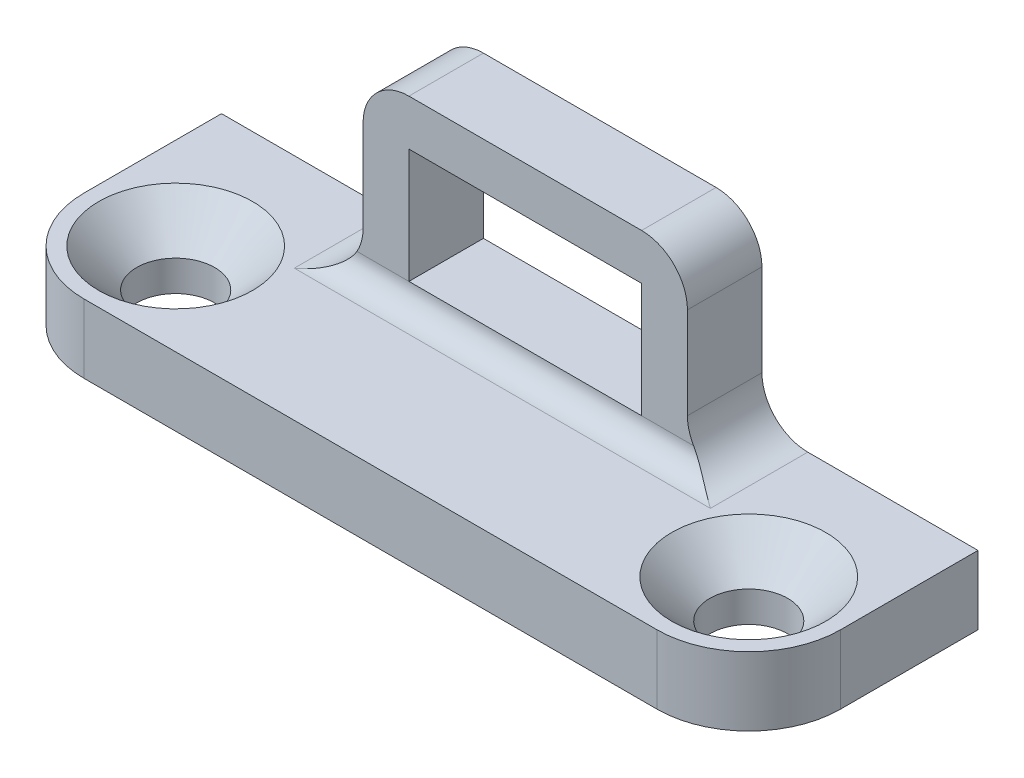
ISO-10303-21;
HEADER;
FILE_DESCRIPTION(('STEP AP214'),'2;1');
FILE_NAME('part.step','',(''),(''),'','','');
FILE_SCHEMA(('AUTOMOTIVE_DESIGN { 1 0 10303 214 1 1 1 1 }'));
ENDSEC;
DATA;
#1=APPLICATION_CONTEXT('core data for automotive mechanical design processes');
#2=APPLICATION_PROTOCOL_DEFINITION('international standard','automotive_design',2000,#1);
#3=PRODUCT_CONTEXT('',#1,'mechanical');
#4=PRODUCT('Part','Part','',(#3));
#5=PRODUCT_RELATED_PRODUCT_CATEGORY('part','',(#4));
#6=PRODUCT_DEFINITION_FORMATION('','',#4);
#7=PRODUCT_DEFINITION_CONTEXT('part definition',#1,'design');
#8=PRODUCT_DEFINITION('design','',#6,#7);
#9=PRODUCT_DEFINITION_SHAPE('','',#8);
#10=(LENGTH_UNIT() NAMED_UNIT(*) SI_UNIT(.MILLI.,.METRE.));
#11=(NAMED_UNIT(*) PLANE_ANGLE_UNIT() SI_UNIT($,.RADIAN.));
#12=(NAMED_UNIT(*) SI_UNIT($,.STERADIAN.) SOLID_ANGLE_UNIT());
#13=UNCERTAINTY_MEASURE_WITH_UNIT(LENGTH_MEASURE(1.E-05),#10,'distance_accuracy_value','');
#14=(GEOMETRIC_REPRESENTATION_CONTEXT(3) GLOBAL_UNCERTAINTY_ASSIGNED_CONTEXT((#13)) GLOBAL_UNIT_ASSIGNED_CONTEXT((#10,
#11,#12)) REPRESENTATION_CONTEXT('',''));
#15=CARTESIAN_POINT('',(0.,0.,0.));
#16=DIRECTION('',(0.,0.,1.));
#17=DIRECTION('',(1.,0.,0.));
#18=AXIS2_PLACEMENT_3D('',#15,#16,#17);
#19=CARTESIAN_POINT('',(16.5,3.,0.));
#20=DIRECTION('',(1.,0.,0.));
#21=DIRECTION('',(0.,0.,-1.));
#22=AXIS2_PLACEMENT_3D('',#19,#20,#21);
#23=PLANE('',#22);
#24=DIRECTION('',(0.,0.,1.));
#25=VECTOR('',#24,1.);
#26=CARTESIAN_POINT('',(16.5,3.,0.));
#27=LINE('',#26,#25);
#28=CARTESIAN_POINT('',(16.5,3.,0.));
#29=VERTEX_POINT('',#28);
#30=CARTESIAN_POINT('',(16.5,3.,6.));
#31=VERTEX_POINT('',#30);
#32=EDGE_CURVE('E248',#29,#31,#27,.T.);
#33=ORIENTED_EDGE('',*,*,#32,.T.);
#34=DIRECTION('',(0.,-1.,0.));
#35=VECTOR('',#34,1.);
#36=CARTESIAN_POINT('',(16.5,0.,6.));
#37=LINE('',#36,#35);
#38=CARTESIAN_POINT('',(16.5,0.,6.));
#39=VERTEX_POINT('',#38);
#40=EDGE_CURVE('E296',#31,#39,#37,.T.);
#41=ORIENTED_EDGE('',*,*,#40,.T.);
#42=DIRECTION('',(0.,0.,1.));
#43=VECTOR('',#42,1.);
#44=CARTESIAN_POINT('',(16.5,0.,0.));
#45=LINE('',#44,#43);
#46=CARTESIAN_POINT('',(16.5,0.,0.));
#47=VERTEX_POINT('',#46);
#48=EDGE_CURVE('E263',#47,#39,#45,.T.);
#49=ORIENTED_EDGE('',*,*,#48,.F.);
#50=DIRECTION('',(0.,-1.,0.));
#51=VECTOR('',#50,1.);
#52=CARTESIAN_POINT('',(16.5,3.,0.));
#53=LINE('',#52,#51);
#54=EDGE_CURVE('E275',#29,#47,#53,.T.);
#55=ORIENTED_EDGE('',*,*,#54,.F.);
#56=EDGE_LOOP('',(#33,#41,#49,#55));
#57=FACE_BOUND('',#56,.T.);
#58=ADVANCED_FACE('F35',(#57),#23,.T.);
#59=CARTESIAN_POINT('',(0.,3.,0.));
#60=DIRECTION('',(0.,0.,-1.));
#61=DIRECTION('',(-1.,0.,0.));
#62=AXIS2_PLACEMENT_3D('',#59,#60,#61);
#63=PLANE('',#62);
#64=DIRECTION('',(0.,1.,0.));
#65=VECTOR('',#64,1.);
#66=CARTESIAN_POINT('',(5.075,9.,0.));
#67=LINE('',#66,#65);
#68=CARTESIAN_POINT('',(5.075,4.,0.));
#69=VERTEX_POINT('',#68);
#70=CARTESIAN_POINT('',(5.075,9.,0.));
#71=VERTEX_POINT('',#70);
#72=EDGE_CURVE('E177',#69,#71,#67,.T.);
#73=ORIENTED_EDGE('',*,*,#72,.T.);
#74=DIRECTION('',(-1.,0.,0.));
#75=VECTOR('',#74,1.);
#76=CARTESIAN_POINT('',(5.075,9.,0.));
#77=LINE('',#76,#75);
#78=CARTESIAN_POINT('',(-5.075,9.,0.));
#79=VERTEX_POINT('',#78);
#80=EDGE_CURVE('E188',#71,#79,#77,.T.);
#81=ORIENTED_EDGE('',*,*,#80,.T.);
#82=DIRECTION('',(0.,-1.,0.));
#83=VECTOR('',#82,1.);
#84=CARTESIAN_POINT('',(-5.075,9.,0.));
#85=LINE('',#84,#83);
#86=CARTESIAN_POINT('',(-5.075,4.,0.));
#87=VERTEX_POINT('',#86);
#88=EDGE_CURVE('E192',#79,#87,#85,.T.);
#89=ORIENTED_EDGE('',*,*,#88,.T.);
#90=DIRECTION('',(1.,0.,0.));
#91=VECTOR('',#90,1.);
#92=CARTESIAN_POINT('',(5.075,4.,0.));
#93=LINE('',#92,#91);
#94=EDGE_CURVE('E184',#87,#69,#93,.T.);
#95=ORIENTED_EDGE('',*,*,#94,.T.);
#96=EDGE_LOOP('',(#73,#81,#89,#95));
#97=FACE_BOUND('',#96,.T.);
#98=DIRECTION('',(0.,1.,0.));
#99=VECTOR('',#98,1.);
#100=CARTESIAN_POINT('',(-7.075,3.,0.));
#101=LINE('',#100,#99);
#102=CARTESIAN_POINT('',(-7.075,5.,0.));
#103=VERTEX_POINT('',#102);
#104=CARTESIAN_POINT('',(-7.075,9.,0.));
#105=VERTEX_POINT('',#104);
#106=EDGE_CURVE('E212',#103,#105,#101,.T.);
#107=ORIENTED_EDGE('',*,*,#106,.T.);
#108=CARTESIAN_POINT('',(-5.075,9.,0.));
#109=DIRECTION('',(0.,0.,-1.));
#110=DIRECTION('',(-1.,0.,0.));
#111=AXIS2_PLACEMENT_3D('',#108,#109,#110);
#112=CIRCLE('',#111,2.);
#113=CARTESIAN_POINT('',(-5.075,11.,0.));
#114=VERTEX_POINT('',#113);
#115=EDGE_CURVE('E316',#105,#114,#112,.T.);
#116=ORIENTED_EDGE('',*,*,#115,.T.);
#117=DIRECTION('',(1.,0.,0.));
#118=VECTOR('',#117,1.);
#119=CARTESIAN_POINT('',(7.075,11.,0.));
#120=LINE('',#119,#118);
#121=CARTESIAN_POINT('',(5.075,11.,0.));
#122=VERTEX_POINT('',#121);
#123=EDGE_CURVE('E230',#114,#122,#120,.T.);
#124=ORIENTED_EDGE('',*,*,#123,.T.);
#125=CARTESIAN_POINT('',(5.075,9.,0.));
#126=DIRECTION('',(0.,0.,-1.));
#127=DIRECTION('',(-1.,0.,0.));
#128=AXIS2_PLACEMENT_3D('',#125,#126,#127);
#129=CIRCLE('',#128,2.);
#130=CARTESIAN_POINT('',(7.075,9.,0.));
#131=VERTEX_POINT('',#130);
#132=EDGE_CURVE('E314',#122,#131,#129,.T.);
#133=ORIENTED_EDGE('',*,*,#132,.T.);
#134=DIRECTION('',(0.,-1.,0.));
#135=VECTOR('',#134,1.);
#136=CARTESIAN_POINT('',(7.075,3.,0.));
#137=LINE('',#136,#135);
#138=CARTESIAN_POINT('',(7.075,5.,0.));
#139=VERTEX_POINT('',#138);
#140=EDGE_CURVE('E221',#131,#139,#137,.T.);
#141=ORIENTED_EDGE('',*,*,#140,.T.);
#142=CARTESIAN_POINT('',(9.075,5.,0.));
#143=DIRECTION('',(0.,0.,-1.));
#144=DIRECTION('',(-1.,0.,0.));
#145=AXIS2_PLACEMENT_3D('',#142,#143,#144);
#146=CIRCLE('',#145,2.);
#147=CARTESIAN_POINT('',(9.075,3.,0.));
#148=VERTEX_POINT('',#147);
#149=EDGE_CURVE('E331',#139,#148,#146,.F.);
#150=ORIENTED_EDGE('',*,*,#149,.T.);
#151=DIRECTION('',(1.,0.,0.));
#152=VECTOR('',#151,1.);
#153=CARTESIAN_POINT('',(0.,3.,0.));
#154=LINE('',#153,#152);
#155=EDGE_CURVE('E251',#148,#29,#154,.T.);
#156=ORIENTED_EDGE('',*,*,#155,.T.);
#157=ORIENTED_EDGE('',*,*,#54,.T.);
#158=DIRECTION('',(1.,0.,0.));
#159=VECTOR('',#158,1.);
#160=CARTESIAN_POINT('',(0.,0.,0.));
#161=LINE('',#160,#159);
#162=CARTESIAN_POINT('',(-16.5,0.,0.));
#163=VERTEX_POINT('',#162);
#164=EDGE_CURVE('E266',#163,#47,#161,.T.);
#165=ORIENTED_EDGE('',*,*,#164,.F.);
#166=DIRECTION('',(0.,-1.,0.));
#167=VECTOR('',#166,1.);
#168=CARTESIAN_POINT('',(-16.5,3.,0.));
#169=LINE('',#168,#167);
#170=CARTESIAN_POINT('',(-16.5,3.,0.));
#171=VERTEX_POINT('',#170);
#172=EDGE_CURVE('E262',#171,#163,#169,.T.);
#173=ORIENTED_EDGE('',*,*,#172,.F.);
#174=CARTESIAN_POINT('',(-9.075,3.,0.));
#175=VERTEX_POINT('',#174);
#176=EDGE_CURVE('E253',#171,#175,#154,.T.);
#177=ORIENTED_EDGE('',*,*,#176,.T.);
#178=CARTESIAN_POINT('',(-9.075,5.,0.));
#179=DIRECTION('',(0.,0.,-1.));
#180=DIRECTION('',(-1.,0.,0.));
#181=AXIS2_PLACEMENT_3D('',#178,#179,#180);
#182=CIRCLE('',#181,2.);
#183=EDGE_CURVE('E327',#175,#103,#182,.F.);
#184=ORIENTED_EDGE('',*,*,#183,.T.);
#185=EDGE_LOOP('',(#107,#116,#124,#133,#141,#150,#156,#157,#165,#173,#177,#184));
#186=FACE_BOUND('',#185,.T.);
#187=ADVANCED_FACE('F194',(#97,#186),#63,.T.);
#188=CARTESIAN_POINT('',(-16.5,3.,0.));
#189=DIRECTION('',(1.,0.,0.));
#190=DIRECTION('',(0.,0.,-1.));
#191=AXIS2_PLACEMENT_3D('',#188,#189,#190);
#192=PLANE('',#191);
#193=DIRECTION('',(0.,0.,1.));
#194=VECTOR('',#193,1.);
#195=CARTESIAN_POINT('',(-16.5,0.,0.));
#196=LINE('',#195,#194);
#197=CARTESIAN_POINT('',(-16.5,0.,5.99999999999999));
#198=VERTEX_POINT('',#197);
#199=EDGE_CURVE('E269',#163,#198,#196,.T.);
#200=ORIENTED_EDGE('',*,*,#199,.T.);
#201=DIRECTION('',(0.,-1.,0.));
#202=VECTOR('',#201,1.);
#203=CARTESIAN_POINT('',(-16.5,3.,5.99999999999999));
#204=LINE('',#203,#202);
#205=CARTESIAN_POINT('',(-16.5,3.,5.99999999999999));
#206=VERTEX_POINT('',#205);
#207=EDGE_CURVE('E290',#198,#206,#204,.F.);
#208=ORIENTED_EDGE('',*,*,#207,.T.);
#209=DIRECTION('',(0.,0.,1.));
#210=VECTOR('',#209,1.);
#211=CARTESIAN_POINT('',(-16.5,3.,0.));
#212=LINE('',#211,#210);
#213=EDGE_CURVE('E256',#171,#206,#212,.T.);
#214=ORIENTED_EDGE('',*,*,#213,.F.);
#215=ORIENTED_EDGE('',*,*,#172,.T.);
#216=EDGE_LOOP('',(#200,#208,#214,#215));
#217=FACE_BOUND('',#216,.T.);
#218=ADVANCED_FACE('F373',(#217),#192,.F.);
#219=CARTESIAN_POINT('',(0.,3.,9.99999999999999));
#220=DIRECTION('',(0.,0.,-1.));
#221=DIRECTION('',(-1.,0.,0.));
#222=AXIS2_PLACEMENT_3D('',#219,#220,#221);
#223=PLANE('',#222);
#224=DIRECTION('',(1.,0.,0.));
#225=VECTOR('',#224,1.);
#226=CARTESIAN_POINT('',(0.,3.,9.99999999999999));
#227=LINE('',#226,#225);
#228=CARTESIAN_POINT('',(-12.5,3.,9.99999999999999));
#229=VERTEX_POINT('',#228);
#230=CARTESIAN_POINT('',(12.5,3.,10.));
#231=VERTEX_POINT('',#230);
#232=EDGE_CURVE('E259',#229,#231,#227,.T.);
#233=ORIENTED_EDGE('',*,*,#232,.F.);
#234=DIRECTION('',(0.,-1.,0.));
#235=VECTOR('',#234,1.);
#236=CARTESIAN_POINT('',(-12.5,3.,9.99999999999999));
#237=LINE('',#236,#235);
#238=CARTESIAN_POINT('',(-12.5,0.,9.99999999999999));
#239=VERTEX_POINT('',#238);
#240=EDGE_CURVE('E283',#229,#239,#237,.T.);
#241=ORIENTED_EDGE('',*,*,#240,.T.);
#242=DIRECTION('',(1.,0.,0.));
#243=VECTOR('',#242,1.);
#244=CARTESIAN_POINT('',(0.,0.,9.99999999999999));
#245=LINE('',#244,#243);
#246=CARTESIAN_POINT('',(12.5,0.,10.));
#247=VERTEX_POINT('',#246);
#248=EDGE_CURVE('E252',#239,#247,#245,.T.);
#249=ORIENTED_EDGE('',*,*,#248,.T.);
#250=DIRECTION('',(0.,-1.,0.));
#251=VECTOR('',#250,1.);
#252=CARTESIAN_POINT('',(12.5,3.,10.));
#253=LINE('',#252,#251);
#254=EDGE_CURVE('E277',#247,#231,#253,.F.);
#255=ORIENTED_EDGE('',*,*,#254,.T.);
#256=EDGE_LOOP('',(#233,#241,#249,#255));
#257=FACE_BOUND('',#256,.T.);
#258=ADVANCED_FACE('F400',(#257),#223,.F.);
#259=CARTESIAN_POINT('',(0.,3.,0.));
#260=DIRECTION('',(0.,1.,0.));
#261=DIRECTION('',(0.,0.,1.));
#262=AXIS2_PLACEMENT_3D('',#259,#260,#261);
#263=PLANE('',#262);
#264=DIRECTION('',(-1.,0.,0.));
#265=VECTOR('',#264,1.);
#266=CARTESIAN_POINT('',(-9.075,3.,4.25));
#267=LINE('',#266,#265);
#268=CARTESIAN_POINT('',(9.075,3.,4.25));
#269=VERTEX_POINT('',#268);
#270=CARTESIAN_POINT('',(-9.075,3.,4.25));
#271=VERTEX_POINT('',#270);
#272=EDGE_CURVE('E335',#269,#271,#267,.T.);
#273=ORIENTED_EDGE('',*,*,#272,.T.);
#274=DIRECTION('',(0.,0.,-1.));
#275=VECTOR('',#274,1.);
#276=CARTESIAN_POINT('',(-9.075,3.,0.));
#277=LINE('',#276,#275);
#278=EDGE_CURVE('E301',#271,#175,#277,.T.);
#279=ORIENTED_EDGE('',*,*,#278,.T.);
#280=ORIENTED_EDGE('',*,*,#176,.F.);
#281=ORIENTED_EDGE('',*,*,#213,.T.);
#282=CARTESIAN_POINT('',(-12.5,3.,5.99999999999999));
#283=DIRECTION('',(0.,1.,0.));
#284=DIRECTION('',(0.,0.,1.));
#285=AXIS2_PLACEMENT_3D('',#282,#283,#284);
#286=CIRCLE('',#285,4.);
#287=EDGE_CURVE('E294',#206,#229,#286,.T.);
#288=ORIENTED_EDGE('',*,*,#287,.T.);
#289=ORIENTED_EDGE('',*,*,#232,.T.);
#290=CARTESIAN_POINT('',(12.5,3.,6.));
#291=DIRECTION('',(0.,1.,0.));
#292=DIRECTION('',(0.,0.,1.));
#293=AXIS2_PLACEMENT_3D('',#290,#291,#292);
#294=CIRCLE('',#293,4.);
#295=EDGE_CURVE('E292',#231,#31,#294,.T.);
#296=ORIENTED_EDGE('',*,*,#295,.T.);
#297=ORIENTED_EDGE('',*,*,#32,.F.);
#298=ORIENTED_EDGE('',*,*,#155,.F.);
#299=DIRECTION('',(0.,0.,-1.));
#300=VECTOR('',#299,1.);
#301=CARTESIAN_POINT('',(9.075,3.,3.25));
#302=LINE('',#301,#300);
#303=EDGE_CURVE('E299',#148,#269,#302,.F.);
#304=ORIENTED_EDGE('',*,*,#303,.T.);
#305=EDGE_LOOP('',(#273,#279,#280,#281,#288,#289,#296,#297,#298,#304));
#306=FACE_BOUND('',#305,.T.);
#307=CARTESIAN_POINT('',(-12.5,3.,6.));
#308=DIRECTION('',(0.,1.,0.));
#309=DIRECTION('',(0.,0.,1.));
#310=AXIS2_PLACEMENT_3D('',#307,#308,#309);
#311=CIRCLE('',#310,3.36);
#312=CARTESIAN_POINT('',(-12.5,3.,9.36));
#313=VERTEX_POINT('',#312);
#314=EDGE_CURVE('E227',#313,#313,#311,.T.);
#315=ORIENTED_EDGE('',*,*,#314,.F.);
#316=EDGE_LOOP('',(#315));
#317=FACE_BOUND('',#316,.T.);
#318=CARTESIAN_POINT('',(12.5,3.,5.99999999999999));
#319=DIRECTION('',(0.,1.,0.));
#320=DIRECTION('',(0.,0.,1.));
#321=AXIS2_PLACEMENT_3D('',#318,#319,#320);
#322=CIRCLE('',#321,3.36);
#323=CARTESIAN_POINT('',(12.5,3.,9.35999999999999));
#324=VERTEX_POINT('',#323);
#325=EDGE_CURVE('E241',#324,#324,#322,.T.);
#326=ORIENTED_EDGE('',*,*,#325,.F.);
#327=EDGE_LOOP('',(#326));
#328=FACE_BOUND('',#327,.T.);
#329=ADVANCED_FACE('F394',(#306,#317,#328),#263,.T.);
#330=CARTESIAN_POINT('',(0.,0.,0.));
#331=DIRECTION('',(0.,1.,0.));
#332=DIRECTION('',(0.,0.,1.));
#333=AXIS2_PLACEMENT_3D('',#330,#331,#332);
#334=PLANE('',#333);
#335=CARTESIAN_POINT('',(-12.5,0.,6.));
#336=DIRECTION('',(0.,1.,0.));
#337=DIRECTION('',(0.,0.,1.));
#338=AXIS2_PLACEMENT_3D('',#335,#336,#337);
#339=CIRCLE('',#338,1.7);
#340=CARTESIAN_POINT('',(-12.5,0.,7.69999999999999));
#341=VERTEX_POINT('',#340);
#342=EDGE_CURVE('E240',#341,#341,#339,.T.);
#343=ORIENTED_EDGE('',*,*,#342,.T.);
#344=EDGE_LOOP('',(#343));
#345=FACE_BOUND('',#344,.T.);
#346=CARTESIAN_POINT('',(12.5,0.,5.99999999999999));
#347=DIRECTION('',(0.,1.,0.));
#348=DIRECTION('',(0.,0.,1.));
#349=AXIS2_PLACEMENT_3D('',#346,#347,#348);
#350=CIRCLE('',#349,1.7);
#351=CARTESIAN_POINT('',(12.5,0.,7.69999999999999));
#352=VERTEX_POINT('',#351);
#353=EDGE_CURVE('E247',#352,#352,#350,.T.);
#354=ORIENTED_EDGE('',*,*,#353,.T.);
#355=EDGE_LOOP('',(#354));
#356=FACE_BOUND('',#355,.T.);
#357=ORIENTED_EDGE('',*,*,#248,.F.);
#358=CARTESIAN_POINT('',(-12.5,0.,5.99999999999999));
#359=DIRECTION('',(0.,1.,0.));
#360=DIRECTION('',(0.,0.,1.));
#361=AXIS2_PLACEMENT_3D('',#358,#359,#360);
#362=CIRCLE('',#361,4.);
#363=EDGE_CURVE('E288',#239,#198,#362,.F.);
#364=ORIENTED_EDGE('',*,*,#363,.T.);
#365=ORIENTED_EDGE('',*,*,#199,.F.);
#366=ORIENTED_EDGE('',*,*,#164,.T.);
#367=ORIENTED_EDGE('',*,*,#48,.T.);
#368=CARTESIAN_POINT('',(12.5,0.,6.));
#369=DIRECTION('',(0.,1.,0.));
#370=DIRECTION('',(0.,0.,1.));
#371=AXIS2_PLACEMENT_3D('',#368,#369,#370);
#372=CIRCLE('',#371,4.);
#373=EDGE_CURVE('E286',#39,#247,#372,.F.);
#374=ORIENTED_EDGE('',*,*,#373,.T.);
#375=EDGE_LOOP('',(#357,#364,#365,#366,#367,#374));
#376=FACE_BOUND('',#375,.T.);
#377=ADVANCED_FACE('F419',(#345,#356,#376),#334,.F.);
#378=CARTESIAN_POINT('',(12.5,3.,5.99999999999999));
#379=DIRECTION('',(0.,1.,0.));
#380=DIRECTION('',(0.,0.,1.));
#381=AXIS2_PLACEMENT_3D('',#378,#379,#380);
#382=CYLINDRICAL_SURFACE('',#381,1.7);
#383=CARTESIAN_POINT('',(12.5,1.34,5.99999999999999));
#384=DIRECTION('',(0.,1.,0.));
#385=DIRECTION('',(0.,0.,1.));
#386=AXIS2_PLACEMENT_3D('',#383,#384,#385);
#387=CIRCLE('',#386,1.7);
#388=CARTESIAN_POINT('',(12.5,1.34,7.69999999999999));
#389=VERTEX_POINT('',#388);
#390=EDGE_CURVE('E244',#389,#389,#387,.T.);
#391=ORIENTED_EDGE('',*,*,#390,.T.);
#392=EDGE_LOOP('',(#391));
#393=FACE_BOUND('',#392,.T.);
#394=ORIENTED_EDGE('',*,*,#353,.F.);
#395=EDGE_LOOP('',(#394));
#396=FACE_BOUND('',#395,.T.);
#397=ADVANCED_FACE('F421',(#393,#396),#382,.F.);
#398=CARTESIAN_POINT('',(12.5,3.,5.99999999999999));
#399=DIRECTION('',(0.,1.,0.));
#400=DIRECTION('',(0.,0.,1.));
#401=AXIS2_PLACEMENT_3D('',#398,#399,#400);
#402=CONICAL_SURFACE('',#401,3.36,0.785398163397448);
#403=ORIENTED_EDGE('',*,*,#390,.F.);
#404=EDGE_LOOP('',(#403));
#405=FACE_BOUND('',#404,.T.);
#406=ORIENTED_EDGE('',*,*,#325,.T.);
#407=EDGE_LOOP('',(#406));
#408=FACE_BOUND('',#407,.T.);
#409=ADVANCED_FACE('F428',(#405,#408),#402,.F.);
#410=CARTESIAN_POINT('',(-12.5,3.,6.));
#411=DIRECTION('',(0.,1.,0.));
#412=DIRECTION('',(0.,0.,1.));
#413=AXIS2_PLACEMENT_3D('',#410,#411,#412);
#414=CYLINDRICAL_SURFACE('',#413,1.7);
#415=CARTESIAN_POINT('',(-12.5,1.34,6.));
#416=DIRECTION('',(0.,1.,0.));
#417=DIRECTION('',(0.,0.,1.));
#418=AXIS2_PLACEMENT_3D('',#415,#416,#417);
#419=CIRCLE('',#418,1.7);
#420=CARTESIAN_POINT('',(-12.5,1.34,7.69999999999999));
#421=VERTEX_POINT('',#420);
#422=EDGE_CURVE('E237',#421,#421,#419,.T.);
#423=ORIENTED_EDGE('',*,*,#422,.T.);
#424=EDGE_LOOP('',(#423));
#425=FACE_BOUND('',#424,.T.);
#426=ORIENTED_EDGE('',*,*,#342,.F.);
#427=EDGE_LOOP('',(#426));
#428=FACE_BOUND('',#427,.T.);
#429=ADVANCED_FACE('F386',(#425,#428),#414,.F.);
#430=CARTESIAN_POINT('',(-12.5,3.,6.));
#431=DIRECTION('',(0.,1.,0.));
#432=DIRECTION('',(0.,0.,1.));
#433=AXIS2_PLACEMENT_3D('',#430,#431,#432);
#434=CONICAL_SURFACE('',#433,3.36,0.785398163397448);
#435=ORIENTED_EDGE('',*,*,#422,.F.);
#436=EDGE_LOOP('',(#435));
#437=FACE_BOUND('',#436,.T.);
#438=ORIENTED_EDGE('',*,*,#314,.T.);
#439=EDGE_LOOP('',(#438));
#440=FACE_BOUND('',#439,.T.);
#441=ADVANCED_FACE('F378',(#437,#440),#434,.F.);
#442=CARTESIAN_POINT('',(-12.5,3.,5.99999999999999));
#443=DIRECTION('',(0.,-1.,0.));
#444=DIRECTION('',(0.,0.,-1.));
#445=AXIS2_PLACEMENT_3D('',#442,#443,#444);
#446=CYLINDRICAL_SURFACE('',#445,4.);
#447=ORIENTED_EDGE('',*,*,#287,.F.);
#448=ORIENTED_EDGE('',*,*,#207,.F.);
#449=ORIENTED_EDGE('',*,*,#363,.F.);
#450=ORIENTED_EDGE('',*,*,#240,.F.);
#451=EDGE_LOOP('',(#447,#448,#449,#450));
#452=FACE_BOUND('',#451,.T.);
#453=ADVANCED_FACE('F376',(#452),#446,.T.);
#454=CARTESIAN_POINT('',(12.5,3.,6.));
#455=DIRECTION('',(0.,1.,0.));
#456=DIRECTION('',(0.,0.,1.));
#457=AXIS2_PLACEMENT_3D('',#454,#455,#456);
#458=CYLINDRICAL_SURFACE('',#457,4.);
#459=ORIENTED_EDGE('',*,*,#295,.F.);
#460=ORIENTED_EDGE('',*,*,#254,.F.);
#461=ORIENTED_EDGE('',*,*,#373,.F.);
#462=ORIENTED_EDGE('',*,*,#40,.F.);
#463=EDGE_LOOP('',(#459,#460,#461,#462));
#464=FACE_BOUND('',#463,.T.);
#465=ADVANCED_FACE('F350',(#464),#458,.T.);
#466=CARTESIAN_POINT('',(-7.075,3.,3.25));
#467=DIRECTION('',(-1.,0.,0.));
#468=DIRECTION('',(0.,-1.,0.));
#469=AXIS2_PLACEMENT_3D('',#466,#467,#468);
#470=PLANE('',#469);
#471=ORIENTED_EDGE('',*,*,#106,.F.);
#472=DIRECTION('',(0.,0.,-1.));
#473=VECTOR('',#472,1.);
#474=CARTESIAN_POINT('',(-7.075,5.,3.25));
#475=LINE('',#474,#473);
#476=CARTESIAN_POINT('',(-7.075,5.,3.25));
#477=VERTEX_POINT('',#476);
#478=EDGE_CURVE('E307',#103,#477,#475,.F.);
#479=ORIENTED_EDGE('',*,*,#478,.T.);
#480=DIRECTION('',(0.,1.,0.));
#481=VECTOR('',#480,1.);
#482=CARTESIAN_POINT('',(-7.075,3.,3.25));
#483=LINE('',#482,#481);
#484=CARTESIAN_POINT('',(-7.075,9.,3.25));
#485=VERTEX_POINT('',#484);
#486=EDGE_CURVE('E217',#477,#485,#483,.T.);
#487=ORIENTED_EDGE('',*,*,#486,.T.);
#488=DIRECTION('',(0.,0.,-1.));
#489=VECTOR('',#488,1.);
#490=CARTESIAN_POINT('',(-7.075,9.,3.25));
#491=LINE('',#490,#489);
#492=EDGE_CURVE('E304',#485,#105,#491,.T.);
#493=ORIENTED_EDGE('',*,*,#492,.T.);
#494=EDGE_LOOP('',(#471,#479,#487,#493));
#495=FACE_BOUND('',#494,.T.);
#496=ADVANCED_FACE('F384',(#495),#470,.T.);
#497=CARTESIAN_POINT('',(7.075,3.,3.25));
#498=DIRECTION('',(1.,0.,0.));
#499=DIRECTION('',(0.,1.,0.));
#500=AXIS2_PLACEMENT_3D('',#497,#498,#499);
#501=PLANE('',#500);
#502=DIRECTION('',(0.,-1.,0.));
#503=VECTOR('',#502,1.);
#504=CARTESIAN_POINT('',(7.075,3.,3.25));
#505=LINE('',#504,#503);
#506=CARTESIAN_POINT('',(7.075,9.,3.25));
#507=VERTEX_POINT('',#506);
#508=CARTESIAN_POINT('',(7.075,5.,3.25));
#509=VERTEX_POINT('',#508);
#510=EDGE_CURVE('E224',#507,#509,#505,.T.);
#511=ORIENTED_EDGE('',*,*,#510,.T.);
#512=DIRECTION('',(0.,0.,-1.));
#513=VECTOR('',#512,1.);
#514=CARTESIAN_POINT('',(7.075,5.,0.));
#515=LINE('',#514,#513);
#516=EDGE_CURVE('E311',#509,#139,#515,.T.);
#517=ORIENTED_EDGE('',*,*,#516,.T.);
#518=ORIENTED_EDGE('',*,*,#140,.F.);
#519=DIRECTION('',(0.,0.,-1.));
#520=VECTOR('',#519,1.);
#521=CARTESIAN_POINT('',(7.075,9.,3.25));
#522=LINE('',#521,#520);
#523=EDGE_CURVE('E309',#131,#507,#522,.F.);
#524=ORIENTED_EDGE('',*,*,#523,.T.);
#525=EDGE_LOOP('',(#511,#517,#518,#524));
#526=FACE_BOUND('',#525,.T.);
#527=ADVANCED_FACE('F526',(#526),#501,.T.);
#528=CARTESIAN_POINT('',(7.075,11.,3.25));
#529=DIRECTION('',(0.,1.,0.));
#530=DIRECTION('',(0.,0.,1.));
#531=AXIS2_PLACEMENT_3D('',#528,#529,#530);
#532=PLANE('',#531);
#533=ORIENTED_EDGE('',*,*,#123,.F.);
#534=DIRECTION('',(0.,0.,-1.));
#535=VECTOR('',#534,1.);
#536=CARTESIAN_POINT('',(-5.075,11.,3.25));
#537=LINE('',#536,#535);
#538=CARTESIAN_POINT('',(-5.075,11.,3.25));
#539=VERTEX_POINT('',#538);
#540=EDGE_CURVE('E321',#114,#539,#537,.F.);
#541=ORIENTED_EDGE('',*,*,#540,.T.);
#542=DIRECTION('',(1.,0.,0.));
#543=VECTOR('',#542,1.);
#544=CARTESIAN_POINT('',(7.075,11.,3.25));
#545=LINE('',#544,#543);
#546=CARTESIAN_POINT('',(5.075,11.,3.25));
#547=VERTEX_POINT('',#546);
#548=EDGE_CURVE('E220',#539,#547,#545,.T.);
#549=ORIENTED_EDGE('',*,*,#548,.T.);
#550=DIRECTION('',(0.,0.,-1.));
#551=VECTOR('',#550,1.);
#552=CARTESIAN_POINT('',(5.075,11.,3.25));
#553=LINE('',#552,#551);
#554=EDGE_CURVE('E318',#547,#122,#553,.T.);
#555=ORIENTED_EDGE('',*,*,#554,.T.);
#556=EDGE_LOOP('',(#533,#541,#549,#555));
#557=FACE_BOUND('',#556,.T.);
#558=ADVANCED_FACE('F462',(#557),#532,.T.);
#559=CARTESIAN_POINT('',(0.,0.,3.25));
#560=DIRECTION('',(0.,0.,1.));
#561=DIRECTION('',(1.,0.,0.));
#562=AXIS2_PLACEMENT_3D('',#559,#560,#561);
#563=PLANE('',#562);
#564=CARTESIAN_POINT('',(-9.075,5.,3.25));
#565=DIRECTION('',(0.,0.,1.));
#566=DIRECTION('',(1.,0.,0.));
#567=AXIS2_PLACEMENT_3D('',#564,#565,#566);
#568=CIRCLE('',#567,2.);
#569=CARTESIAN_POINT('',(-7.34294919243112,4.,3.25));
#570=VERTEX_POINT('',#569);
#571=EDGE_CURVE('E329',#477,#570,#568,.F.);
#572=ORIENTED_EDGE('',*,*,#571,.T.);
#573=DIRECTION('',(-1.,0.,0.));
#574=VECTOR('',#573,1.);
#575=CARTESIAN_POINT('',(9.075,4.,3.25));
#576=LINE('',#575,#574);
#577=CARTESIAN_POINT('',(-5.075,4.,3.25));
#578=VERTEX_POINT('',#577);
#579=EDGE_CURVE('E339',#570,#578,#576,.F.);
#580=ORIENTED_EDGE('',*,*,#579,.T.);
#581=DIRECTION('',(0.,-1.,0.));
#582=VECTOR('',#581,1.);
#583=CARTESIAN_POINT('',(-5.075,9.,3.25));
#584=LINE('',#583,#582);
#585=CARTESIAN_POINT('',(-5.075,9.,3.25));
#586=VERTEX_POINT('',#585);
#587=EDGE_CURVE('E200',#586,#578,#584,.T.);
#588=ORIENTED_EDGE('',*,*,#587,.F.);
#589=DIRECTION('',(-1.,0.,0.));
#590=VECTOR('',#589,1.);
#591=CARTESIAN_POINT('',(5.075,9.,3.25));
#592=LINE('',#591,#590);
#593=CARTESIAN_POINT('',(5.075,9.,3.25));
#594=VERTEX_POINT('',#593);
#595=EDGE_CURVE('E206',#594,#586,#592,.T.);
#596=ORIENTED_EDGE('',*,*,#595,.F.);
#597=DIRECTION('',(0.,1.,0.));
#598=VECTOR('',#597,1.);
#599=CARTESIAN_POINT('',(5.075,9.,3.25));
#600=LINE('',#599,#598);
#601=CARTESIAN_POINT('',(5.075,4.,3.25));
#602=VERTEX_POINT('',#601);
#603=EDGE_CURVE('E179',#602,#594,#600,.T.);
#604=ORIENTED_EDGE('',*,*,#603,.F.);
#605=DIRECTION('',(-1.,0.,0.));
#606=VECTOR('',#605,1.);
#607=CARTESIAN_POINT('',(9.075,4.,3.25));
#608=LINE('',#607,#606);
#609=CARTESIAN_POINT('',(7.34294919243112,4.,3.25));
#610=VERTEX_POINT('',#609);
#611=EDGE_CURVE('E56',#602,#610,#608,.F.);
#612=ORIENTED_EDGE('',*,*,#611,.T.);
#613=CARTESIAN_POINT('',(9.075,5.,3.25));
#614=DIRECTION('',(0.,0.,1.));
#615=DIRECTION('',(1.,0.,0.));
#616=AXIS2_PLACEMENT_3D('',#613,#614,#615);
#617=CIRCLE('',#616,2.);
#618=EDGE_CURVE('E333',#610,#509,#617,.F.);
#619=ORIENTED_EDGE('',*,*,#618,.T.);
#620=ORIENTED_EDGE('',*,*,#510,.F.);
#621=CARTESIAN_POINT('',(5.075,9.,3.25));
#622=DIRECTION('',(0.,0.,1.));
#623=DIRECTION('',(1.,0.,0.));
#624=AXIS2_PLACEMENT_3D('',#621,#622,#623);
#625=CIRCLE('',#624,2.);
#626=EDGE_CURVE('E323',#507,#547,#625,.T.);
#627=ORIENTED_EDGE('',*,*,#626,.T.);
#628=ORIENTED_EDGE('',*,*,#548,.F.);
#629=CARTESIAN_POINT('',(-5.075,9.,3.25));
#630=DIRECTION('',(0.,0.,1.));
#631=DIRECTION('',(1.,0.,0.));
#632=AXIS2_PLACEMENT_3D('',#629,#630,#631);
#633=CIRCLE('',#632,2.);
#634=EDGE_CURVE('E325',#539,#485,#633,.T.);
#635=ORIENTED_EDGE('',*,*,#634,.T.);
#636=ORIENTED_EDGE('',*,*,#486,.F.);
#637=EDGE_LOOP('',(#572,#580,#588,#596,#604,#612,#619,#620,#627,#628,#635,#636));
#638=FACE_BOUND('',#637,.T.);
#639=ADVANCED_FACE('F457',(#638),#563,.T.);
#640=CARTESIAN_POINT('',(5.075,9.,0.));
#641=DIRECTION('',(1.,0.,0.));
#642=DIRECTION('',(0.,1.,0.));
#643=AXIS2_PLACEMENT_3D('',#640,#641,#642);
#644=PLANE('',#643);
#645=ORIENTED_EDGE('',*,*,#603,.T.);
#646=DIRECTION('',(0.,0.,1.));
#647=VECTOR('',#646,1.);
#648=CARTESIAN_POINT('',(5.075,9.,0.));
#649=LINE('',#648,#647);
#650=EDGE_CURVE('E173',#71,#594,#649,.T.);
#651=ORIENTED_EDGE('',*,*,#650,.F.);
#652=ORIENTED_EDGE('',*,*,#72,.F.);
#653=DIRECTION('',(0.,0.,1.));
#654=VECTOR('',#653,1.);
#655=CARTESIAN_POINT('',(5.075,4.,0.));
#656=LINE('',#655,#654);
#657=EDGE_CURVE('E210',#69,#602,#656,.T.);
#658=ORIENTED_EDGE('',*,*,#657,.T.);
#659=EDGE_LOOP('',(#645,#651,#652,#658));
#660=FACE_BOUND('',#659,.T.);
#661=ADVANCED_FACE('F175',(#660),#644,.F.);
#662=CARTESIAN_POINT('',(5.075,4.,0.));
#663=DIRECTION('',(0.,-1.,0.));
#664=DIRECTION('',(0.,0.,-1.));
#665=AXIS2_PLACEMENT_3D('',#662,#663,#664);
#666=PLANE('',#665);
#667=DIRECTION('',(1.,0.,0.));
#668=VECTOR('',#667,1.);
#669=CARTESIAN_POINT('',(5.075,4.,3.25));
#670=LINE('',#669,#668);
#671=EDGE_CURVE('E197',#578,#602,#670,.T.);
#672=ORIENTED_EDGE('',*,*,#671,.T.);
#673=ORIENTED_EDGE('',*,*,#657,.F.);
#674=ORIENTED_EDGE('',*,*,#94,.F.);
#675=DIRECTION('',(0.,0.,1.));
#676=VECTOR('',#675,1.);
#677=CARTESIAN_POINT('',(-5.075,4.,0.));
#678=LINE('',#677,#676);
#679=EDGE_CURVE('E213',#87,#578,#678,.T.);
#680=ORIENTED_EDGE('',*,*,#679,.T.);
#681=EDGE_LOOP('',(#672,#673,#674,#680));
#682=FACE_BOUND('',#681,.T.);
#683=ADVANCED_FACE('F473',(#682),#666,.F.);
#684=CARTESIAN_POINT('',(-5.075,9.,0.));
#685=DIRECTION('',(-1.,0.,0.));
#686=DIRECTION('',(0.,-1.,0.));
#687=AXIS2_PLACEMENT_3D('',#684,#685,#686);
#688=PLANE('',#687);
#689=ORIENTED_EDGE('',*,*,#587,.T.);
#690=ORIENTED_EDGE('',*,*,#679,.F.);
#691=ORIENTED_EDGE('',*,*,#88,.F.);
#692=DIRECTION('',(0.,0.,1.));
#693=VECTOR('',#692,1.);
#694=CARTESIAN_POINT('',(-5.075,9.,0.));
#695=LINE('',#694,#693);
#696=EDGE_CURVE('E183',#79,#586,#695,.T.);
#697=ORIENTED_EDGE('',*,*,#696,.T.);
#698=EDGE_LOOP('',(#689,#690,#691,#697));
#699=FACE_BOUND('',#698,.T.);
#700=ADVANCED_FACE('F482',(#699),#688,.F.);
#701=CARTESIAN_POINT('',(5.075,9.,0.));
#702=DIRECTION('',(0.,1.,0.));
#703=DIRECTION('',(0.,0.,1.));
#704=AXIS2_PLACEMENT_3D('',#701,#702,#703);
#705=PLANE('',#704);
#706=ORIENTED_EDGE('',*,*,#595,.T.);
#707=ORIENTED_EDGE('',*,*,#696,.F.);
#708=ORIENTED_EDGE('',*,*,#80,.F.);
#709=ORIENTED_EDGE('',*,*,#650,.T.);
#710=EDGE_LOOP('',(#706,#707,#708,#709));
#711=FACE_BOUND('',#710,.T.);
#712=ADVANCED_FACE('F189',(#711),#705,.F.);
#713=CARTESIAN_POINT('',(-9.075,5.,0.));
#714=DIRECTION('',(0.,0.,1.));
#715=DIRECTION('',(1.,0.,0.));
#716=AXIS2_PLACEMENT_3D('',#713,#714,#715);
#717=CYLINDRICAL_SURFACE('',#716,2.);
#718=ORIENTED_EDGE('',*,*,#571,.F.);
#719=ORIENTED_EDGE('',*,*,#478,.F.);
#720=ORIENTED_EDGE('',*,*,#183,.F.);
#721=ORIENTED_EDGE('',*,*,#278,.F.);
#722=CARTESIAN_POINT('',(-7.34294919243112,4.,3.25));
#723=CARTESIAN_POINT('',(-7.36456119077684,3.96254044047365,3.24999980568836));
#724=CARTESIAN_POINT('',(-7.38738496198315,3.92583917864711,3.25210319796198));
#725=CARTESIAN_POINT('',(-7.4350917210063,3.85434356320049,3.26001340764259));
#726=CARTESIAN_POINT('',(-7.45996935201582,3.81954461931415,3.26581084038911));
#727=CARTESIAN_POINT('',(-7.51119040135561,3.75249844515592,3.28051235919617));
#728=CARTESIAN_POINT('',(-7.53751003404477,3.72022351684429,3.28937426984246));
#729=CARTESIAN_POINT('',(-7.5916543858414,3.65783971793181,3.3097852158221));
#730=CARTESIAN_POINT('',(-7.61948020246429,3.62773246511539,3.32133623142663));
#731=CARTESIAN_POINT('',(-7.71564684920935,3.52980188192177,3.36423276751056));
#732=CARTESIAN_POINT('',(-7.78698065113304,3.46717437431735,3.40092150342509));
#733=CARTESIAN_POINT('',(-7.93463626052194,3.35431082904296,3.48318766839412));
#734=CARTESIAN_POINT('',(-8.01098566230024,3.30415214096292,3.52881758821574));
#735=CARTESIAN_POINT('',(-8.19839927291761,3.19794475890171,3.64566540445564));
#736=CARTESIAN_POINT('',(-8.31099063977572,3.1477495749302,3.71975815567176));
#737=CARTESIAN_POINT('',(-8.53910128882741,3.06936277484821,3.87397939495328));
#738=CARTESIAN_POINT('',(-8.65461658619791,3.04114271871491,3.95409993406185));
#739=CARTESIAN_POINT('',(-8.86947174018588,3.00809073030031,4.1046835611499));
#740=CARTESIAN_POINT('',(-8.96862557205976,3.00037489576334,4.17478225234926));
#741=CARTESIAN_POINT('',(-9.0701314049216,3.00000444910877,4.24655738388493));
#742=CARTESIAN_POINT('',(-9.0725657315113,3.00000000518405,4.24827871283066));
#743=CARTESIAN_POINT('',(-9.075,3.,4.25));
#744=B_SPLINE_CURVE_WITH_KNOTS('',3,(#722,#723,#724,#725,#726,#727,#728,#729,#730,#731,#732,
#733,#734,#735,#736,#737,#738,#739,#740,#741,#742,#743),.UNSPECIFIED.,.F.,.F.,(4,2,2,2,2,2,2,2,
2,2,4),(0.,0.12959229529458,0.258856668652771,0.386408509268408,0.514054578529991,
0.817592410147225,1.1229686971365,1.55212503753218,1.98072504008937,2.34472916750579,
2.35367344935465),.UNSPECIFIED.);
#745=EDGE_CURVE('E49',#271,#570,#744,.F.);
#746=ORIENTED_EDGE('',*,*,#745,.T.);
#747=EDGE_LOOP('',(#718,#719,#720,#721,#746));
#748=FACE_BOUND('',#747,.T.);
#749=ADVANCED_FACE('F345',(#748),#717,.F.);
#750=CARTESIAN_POINT('',(9.075,5.,3.25));
#751=DIRECTION('',(0.,0.,1.));
#752=DIRECTION('',(1.,0.,0.));
#753=AXIS2_PLACEMENT_3D('',#750,#751,#752);
#754=CYLINDRICAL_SURFACE('',#753,2.);
#755=ORIENTED_EDGE('',*,*,#618,.F.);
#756=CARTESIAN_POINT('',(7.34294919243112,4.,3.25));
#757=CARTESIAN_POINT('',(7.36456119077683,3.96254044047365,3.24999980568836));
#758=CARTESIAN_POINT('',(7.38738496198315,3.92583917864711,3.25210319796198));
#759=CARTESIAN_POINT('',(7.43509172100629,3.85434356320049,3.26001340764259));
#760=CARTESIAN_POINT('',(7.45996935201582,3.81954461931415,3.26581084038911));
#761=CARTESIAN_POINT('',(7.51119040135561,3.75249844515592,3.28051235919617));
#762=CARTESIAN_POINT('',(7.53751003404477,3.72022351684429,3.28937426984246));
#763=CARTESIAN_POINT('',(7.59165438584139,3.65783971793181,3.3097852158221));
#764=CARTESIAN_POINT('',(7.61948020246429,3.62773246511539,3.32133623142663));
#765=CARTESIAN_POINT('',(7.71564684920934,3.52980188192177,3.36423276751056));
#766=CARTESIAN_POINT('',(7.78698065113304,3.46717437431735,3.40092150342509));
#767=CARTESIAN_POINT('',(7.93463626052194,3.35431082904296,3.48318766839412));
#768=CARTESIAN_POINT('',(8.01098566230024,3.30415214096292,3.52881758821574));
#769=CARTESIAN_POINT('',(8.19839927291761,3.19794475890171,3.64566540445564));
#770=CARTESIAN_POINT('',(8.31099063977571,3.1477495749302,3.71975815567176));
#771=CARTESIAN_POINT('',(8.53910128882741,3.06936277484821,3.87397939495328));
#772=CARTESIAN_POINT('',(8.65461658619791,3.04114271871491,3.95409993406185));
#773=CARTESIAN_POINT('',(8.86947174018588,3.00809073030031,4.1046835611499));
#774=CARTESIAN_POINT('',(8.96862557205976,3.00037489576334,4.17478225234926));
#775=CARTESIAN_POINT('',(9.0701314049216,3.00000444910877,4.24655738388493));
#776=CARTESIAN_POINT('',(9.07256573151129,3.00000000518405,4.24827871283066));
#777=CARTESIAN_POINT('',(9.075,3.,4.25));
#778=B_SPLINE_CURVE_WITH_KNOTS('',3,(#756,#757,#758,#759,#760,#761,#762,#763,#764,#765,#766,
#767,#768,#769,#770,#771,#772,#773,#774,#775,#776,#777),.UNSPECIFIED.,.F.,.F.,(4,2,2,2,2,2,2,2,
2,2,4),(0.,0.12959229529458,0.258856668652771,0.386408509268408,0.514054578529991,
0.817592410147225,1.1229686971365,1.55212503753218,1.98072504008937,2.34472916750579,
2.35367344935465),.UNSPECIFIED.);
#779=EDGE_CURVE('E11',#610,#269,#778,.T.);
#780=ORIENTED_EDGE('',*,*,#779,.T.);
#781=ORIENTED_EDGE('',*,*,#303,.F.);
#782=ORIENTED_EDGE('',*,*,#149,.F.);
#783=ORIENTED_EDGE('',*,*,#516,.F.);
#784=EDGE_LOOP('',(#755,#780,#781,#782,#783));
#785=FACE_BOUND('',#784,.T.);
#786=ADVANCED_FACE('F349',(#785),#754,.F.);
#787=CARTESIAN_POINT('',(-5.075,9.,3.25));
#788=DIRECTION('',(0.,0.,-1.));
#789=DIRECTION('',(-1.,0.,0.));
#790=AXIS2_PLACEMENT_3D('',#787,#788,#789);
#791=CYLINDRICAL_SURFACE('',#790,2.);
#792=ORIENTED_EDGE('',*,*,#634,.F.);
#793=ORIENTED_EDGE('',*,*,#540,.F.);
#794=ORIENTED_EDGE('',*,*,#115,.F.);
#795=ORIENTED_EDGE('',*,*,#492,.F.);
#796=EDGE_LOOP('',(#792,#793,#794,#795));
#797=FACE_BOUND('',#796,.T.);
#798=ADVANCED_FACE('F355',(#797),#791,.T.);
#799=CARTESIAN_POINT('',(5.075,9.,3.25));
#800=DIRECTION('',(0.,0.,-1.));
#801=DIRECTION('',(-1.,0.,0.));
#802=AXIS2_PLACEMENT_3D('',#799,#800,#801);
#803=CYLINDRICAL_SURFACE('',#802,2.);
#804=ORIENTED_EDGE('',*,*,#626,.F.);
#805=ORIENTED_EDGE('',*,*,#523,.F.);
#806=ORIENTED_EDGE('',*,*,#132,.F.);
#807=ORIENTED_EDGE('',*,*,#554,.F.);
#808=EDGE_LOOP('',(#804,#805,#806,#807));
#809=FACE_BOUND('',#808,.T.);
#810=ADVANCED_FACE('F358',(#809),#803,.T.);
#811=CARTESIAN_POINT('',(0.,4.,4.25));
#812=DIRECTION('',(1.,0.,0.));
#813=DIRECTION('',(0.,0.,-1.));
#814=AXIS2_PLACEMENT_3D('',#811,#812,#813);
#815=CYLINDRICAL_SURFACE('',#814,1.);
#816=ORIENTED_EDGE('',*,*,#671,.F.);
#817=ORIENTED_EDGE('',*,*,#579,.F.);
#818=ORIENTED_EDGE('',*,*,#745,.F.);
#819=ORIENTED_EDGE('',*,*,#272,.F.);
#820=ORIENTED_EDGE('',*,*,#779,.F.);
#821=ORIENTED_EDGE('',*,*,#611,.F.);
#822=EDGE_LOOP('',(#816,#817,#818,#819,#820,#821));
#823=FACE_BOUND('',#822,.T.);
#824=ADVANCED_FACE('F37',(#823),#815,.F.);
#825=CLOSED_SHELL('',(#58,#187,#218,#258,#329,#377,#397,#409,#429,#441,#453,#465,#496,#527,#558,
#639,#661,#683,#700,#712,#749,#786,#798,#810,#824));
#826=MANIFOLD_SOLID_BREP('B2',#825);
#827=ADVANCED_BREP_SHAPE_REPRESENTATION('',(#18,#826),#14);
#828=SHAPE_DEFINITION_REPRESENTATION(#9,#827);
ENDSEC;
END-ISO-10303-21;
